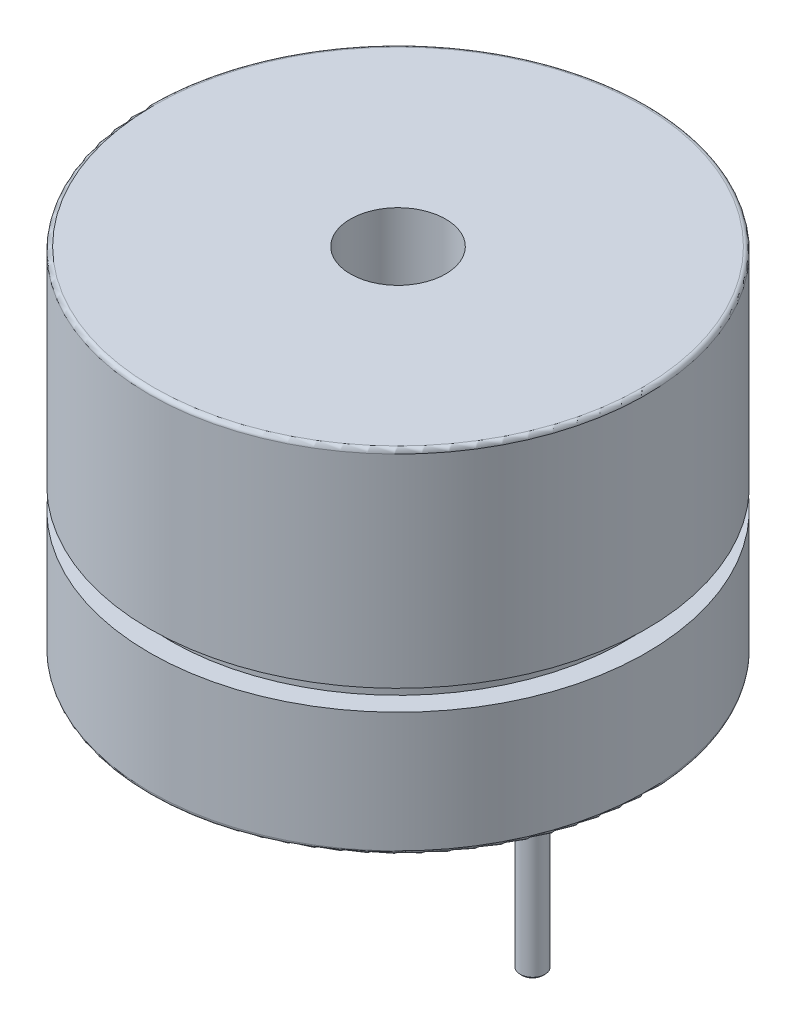
ISO-10303-21;
HEADER;
FILE_DESCRIPTION(('STEP AP214'),'2;1');
FILE_NAME('part.step','',(''),(''),'','','');
FILE_SCHEMA(('AUTOMOTIVE_DESIGN { 1 0 10303 214 1 1 1 1 }'));
ENDSEC;
DATA;
#1=APPLICATION_CONTEXT('core data for automotive mechanical design processes');
#2=APPLICATION_PROTOCOL_DEFINITION('international standard','automotive_design',2000,#1);
#3=PRODUCT_CONTEXT('',#1,'mechanical');
#4=PRODUCT('Part','Part','',(#3));
#5=PRODUCT_RELATED_PRODUCT_CATEGORY('part','',(#4));
#6=PRODUCT_DEFINITION_FORMATION('','',#4);
#7=PRODUCT_DEFINITION_CONTEXT('part definition',#1,'design');
#8=PRODUCT_DEFINITION('design','',#6,#7);
#9=PRODUCT_DEFINITION_SHAPE('','',#8);
#10=(LENGTH_UNIT() NAMED_UNIT(*) SI_UNIT(.MILLI.,.METRE.));
#11=(NAMED_UNIT(*) PLANE_ANGLE_UNIT() SI_UNIT($,.RADIAN.));
#12=(NAMED_UNIT(*) SI_UNIT($,.STERADIAN.) SOLID_ANGLE_UNIT());
#13=UNCERTAINTY_MEASURE_WITH_UNIT(LENGTH_MEASURE(1.E-05),#10,'distance_accuracy_value','');
#14=(GEOMETRIC_REPRESENTATION_CONTEXT(3) GLOBAL_UNCERTAINTY_ASSIGNED_CONTEXT((#13)) GLOBAL_UNIT_ASSIGNED_CONTEXT((#10,
#11,#12)) REPRESENTATION_CONTEXT('',''));
#15=CARTESIAN_POINT('',(0.,0.,0.));
#16=DIRECTION('',(0.,0.,1.));
#17=DIRECTION('',(1.,0.,0.));
#18=AXIS2_PLACEMENT_3D('',#15,#16,#17);
#19=CARTESIAN_POINT('',(0.,0.,0.));
#20=DIRECTION('',(0.,1.,0.));
#21=DIRECTION('',(0.,0.,1.));
#22=AXIS2_PLACEMENT_3D('',#19,#20,#21);
#23=PLANE('',#22);
#24=CARTESIAN_POINT('',(0.,0.,0.));
#25=DIRECTION('',(0.,1.,0.));
#26=DIRECTION('',(0.,0.,1.));
#27=AXIS2_PLACEMENT_3D('',#24,#25,#26);
#28=CIRCLE('',#27,5.9);
#29=CARTESIAN_POINT('',(0.,0.,5.9));
#30=VERTEX_POINT('',#29);
#31=EDGE_CURVE('E59',#30,#30,#28,.F.);
#32=ORIENTED_EDGE('',*,*,#31,.T.);
#33=EDGE_LOOP('',(#32));
#34=FACE_BOUND('',#33,.T.);
#35=CARTESIAN_POINT('',(-3.25,0.,0.));
#36=DIRECTION('',(0.,1.,0.));
#37=DIRECTION('',(0.,0.,1.));
#38=AXIS2_PLACEMENT_3D('',#35,#36,#37);
#39=CIRCLE('',#38,0.3);
#40=CARTESIAN_POINT('',(-3.25,0.,0.3));
#41=VERTEX_POINT('',#40);
#42=EDGE_CURVE('E68',#41,#41,#39,.F.);
#43=ORIENTED_EDGE('',*,*,#42,.F.);
#44=EDGE_LOOP('',(#43));
#45=FACE_BOUND('',#44,.T.);
#46=CARTESIAN_POINT('',(3.25,0.,0.));
#47=DIRECTION('',(0.,1.,0.));
#48=DIRECTION('',(0.,0.,1.));
#49=AXIS2_PLACEMENT_3D('',#46,#47,#48);
#50=CIRCLE('',#49,0.3);
#51=CARTESIAN_POINT('',(3.25,0.,0.300000000000004));
#52=VERTEX_POINT('',#51);
#53=EDGE_CURVE('E65',#52,#52,#50,.F.);
#54=ORIENTED_EDGE('',*,*,#53,.F.);
#55=EDGE_LOOP('',(#54));
#56=FACE_BOUND('',#55,.T.);
#57=ADVANCED_FACE('F33',(#34,#45,#56),#23,.F.);
#58=CARTESIAN_POINT('',(0.,3.,0.));
#59=DIRECTION('',(0.,1.,0.));
#60=DIRECTION('',(0.,0.,1.));
#61=AXIS2_PLACEMENT_3D('',#58,#59,#60);
#62=PLANE('',#61);
#63=CARTESIAN_POINT('',(0.,3.,0.));
#64=DIRECTION('',(0.,1.,0.));
#65=DIRECTION('',(0.,0.,1.));
#66=AXIS2_PLACEMENT_3D('',#63,#64,#65);
#67=CIRCLE('',#66,6.);
#68=CARTESIAN_POINT('',(0.,3.,6.));
#69=VERTEX_POINT('',#68);
#70=EDGE_CURVE('E71',#69,#69,#67,.T.);
#71=ORIENTED_EDGE('',*,*,#70,.T.);
#72=EDGE_LOOP('',(#71));
#73=FACE_BOUND('',#72,.T.);
#74=CARTESIAN_POINT('',(0.,3.,0.));
#75=DIRECTION('',(0.,1.,0.));
#76=DIRECTION('',(0.,0.,1.));
#77=AXIS2_PLACEMENT_3D('',#74,#75,#76);
#78=CIRCLE('',#77,5.5);
#79=CARTESIAN_POINT('',(0.,3.,5.5));
#80=VERTEX_POINT('',#79);
#81=EDGE_CURVE('E75',#80,#80,#78,.T.);
#82=ORIENTED_EDGE('',*,*,#81,.F.);
#83=EDGE_LOOP('',(#82));
#84=FACE_BOUND('',#83,.T.);
#85=ADVANCED_FACE('F112',(#73,#84),#62,.T.);
#86=CARTESIAN_POINT('',(0.,3.,0.));
#87=DIRECTION('',(0.,-1.,0.));
#88=DIRECTION('',(0.,0.,-1.));
#89=AXIS2_PLACEMENT_3D('',#86,#87,#88);
#90=CYLINDRICAL_SURFACE('',#89,6.);
#91=CARTESIAN_POINT('',(0.,0.0999999999999998,0.));
#92=DIRECTION('',(0.,1.,0.));
#93=DIRECTION('',(0.,0.,1.));
#94=AXIS2_PLACEMENT_3D('',#91,#92,#93);
#95=CIRCLE('',#94,6.);
#96=CARTESIAN_POINT('',(0.,0.0999999999999998,6.));
#97=VERTEX_POINT('',#96);
#98=EDGE_CURVE('E62',#97,#97,#95,.T.);
#99=ORIENTED_EDGE('',*,*,#98,.T.);
#100=EDGE_LOOP('',(#99));
#101=FACE_BOUND('',#100,.T.);
#102=ORIENTED_EDGE('',*,*,#70,.F.);
#103=EDGE_LOOP('',(#102));
#104=FACE_BOUND('',#103,.T.);
#105=ADVANCED_FACE('F120',(#101,#104),#90,.T.);
#106=CARTESIAN_POINT('',(0.,3.5,0.));
#107=DIRECTION('',(0.,-1.,0.));
#108=DIRECTION('',(0.,0.,-1.));
#109=AXIS2_PLACEMENT_3D('',#106,#107,#108);
#110=CYLINDRICAL_SURFACE('',#109,5.5);
#111=CARTESIAN_POINT('',(0.,3.5,0.));
#112=DIRECTION('',(0.,1.,0.));
#113=DIRECTION('',(0.,0.,1.));
#114=AXIS2_PLACEMENT_3D('',#111,#112,#113);
#115=CIRCLE('',#114,5.5);
#116=CARTESIAN_POINT('',(0.,3.5,5.5));
#117=VERTEX_POINT('',#116);
#118=EDGE_CURVE('E74',#117,#117,#115,.T.);
#119=ORIENTED_EDGE('',*,*,#118,.F.);
#120=EDGE_LOOP('',(#119));
#121=FACE_BOUND('',#120,.T.);
#122=ORIENTED_EDGE('',*,*,#81,.T.);
#123=EDGE_LOOP('',(#122));
#124=FACE_BOUND('',#123,.T.);
#125=ADVANCED_FACE('F127',(#121,#124),#110,.T.);
#126=CARTESIAN_POINT('',(0.,3.5,0.));
#127=DIRECTION('',(0.,1.,0.));
#128=DIRECTION('',(0.,0.,1.));
#129=AXIS2_PLACEMENT_3D('',#126,#127,#128);
#130=PLANE('',#129);
#131=CARTESIAN_POINT('',(0.,3.5,0.));
#132=DIRECTION('',(0.,1.,0.));
#133=DIRECTION('',(0.,0.,1.));
#134=AXIS2_PLACEMENT_3D('',#131,#132,#133);
#135=CIRCLE('',#134,6.);
#136=CARTESIAN_POINT('',(0.,3.5,6.));
#137=VERTEX_POINT('',#136);
#138=EDGE_CURVE('E78',#137,#137,#135,.T.);
#139=ORIENTED_EDGE('',*,*,#138,.F.);
#140=EDGE_LOOP('',(#139));
#141=FACE_BOUND('',#140,.T.);
#142=ORIENTED_EDGE('',*,*,#118,.T.);
#143=EDGE_LOOP('',(#142));
#144=FACE_BOUND('',#143,.T.);
#145=ADVANCED_FACE('F107',(#141,#144),#130,.F.);
#146=CARTESIAN_POINT('',(0.,8.5,0.));
#147=DIRECTION('',(0.,-1.,0.));
#148=DIRECTION('',(0.,0.,-1.));
#149=AXIS2_PLACEMENT_3D('',#146,#147,#148);
#150=CYLINDRICAL_SURFACE('',#149,6.);
#151=CARTESIAN_POINT('',(0.,8.4,0.));
#152=DIRECTION('',(0.,1.,0.));
#153=DIRECTION('',(0.,0.,1.));
#154=AXIS2_PLACEMENT_3D('',#151,#152,#153);
#155=CIRCLE('',#154,6.);
#156=CARTESIAN_POINT('',(0.,8.4,6.));
#157=VERTEX_POINT('',#156);
#158=EDGE_CURVE('E53',#157,#157,#155,.F.);
#159=ORIENTED_EDGE('',*,*,#158,.T.);
#160=EDGE_LOOP('',(#159));
#161=FACE_BOUND('',#160,.T.);
#162=ORIENTED_EDGE('',*,*,#138,.T.);
#163=EDGE_LOOP('',(#162));
#164=FACE_BOUND('',#163,.T.);
#165=ADVANCED_FACE('F100',(#161,#164),#150,.T.);
#166=CARTESIAN_POINT('',(0.,8.5,0.));
#167=DIRECTION('',(0.,1.,0.));
#168=DIRECTION('',(0.,0.,1.));
#169=AXIS2_PLACEMENT_3D('',#166,#167,#168);
#170=PLANE('',#169);
#171=CARTESIAN_POINT('',(0.,8.5,0.));
#172=DIRECTION('',(0.,1.,0.));
#173=DIRECTION('',(0.,0.,1.));
#174=AXIS2_PLACEMENT_3D('',#171,#172,#173);
#175=CIRCLE('',#174,5.9);
#176=CARTESIAN_POINT('',(0.,8.5,5.9));
#177=VERTEX_POINT('',#176);
#178=EDGE_CURVE('E56',#177,#177,#175,.T.);
#179=ORIENTED_EDGE('',*,*,#178,.T.);
#180=EDGE_LOOP('',(#179));
#181=FACE_BOUND('',#180,.T.);
#182=CARTESIAN_POINT('',(0.,8.5,0.));
#183=DIRECTION('',(0.,1.,0.));
#184=DIRECTION('',(0.,0.,1.));
#185=AXIS2_PLACEMENT_3D('',#182,#183,#184);
#186=CIRCLE('',#185,1.15);
#187=CARTESIAN_POINT('',(0.,8.5,1.15));
#188=VERTEX_POINT('',#187);
#189=EDGE_CURVE('E84',#188,#188,#186,.T.);
#190=ORIENTED_EDGE('',*,*,#189,.F.);
#191=EDGE_LOOP('',(#190));
#192=FACE_BOUND('',#191,.T.);
#193=ADVANCED_FACE('F95',(#181,#192),#170,.T.);
#194=CARTESIAN_POINT('',(0.,3.5,0.));
#195=DIRECTION('',(0.,1.,0.));
#196=DIRECTION('',(0.,0.,1.));
#197=AXIS2_PLACEMENT_3D('',#194,#195,#196);
#198=CYLINDRICAL_SURFACE('',#197,1.15);
#199=CARTESIAN_POINT('',(0.,3.5,0.));
#200=DIRECTION('',(0.,1.,0.));
#201=DIRECTION('',(0.,0.,1.));
#202=AXIS2_PLACEMENT_3D('',#199,#200,#201);
#203=CIRCLE('',#202,1.15);
#204=CARTESIAN_POINT('',(0.,3.5,1.15));
#205=VERTEX_POINT('',#204);
#206=EDGE_CURVE('E83',#205,#205,#203,.T.);
#207=ORIENTED_EDGE('',*,*,#206,.F.);
#208=EDGE_LOOP('',(#207));
#209=FACE_BOUND('',#208,.T.);
#210=ORIENTED_EDGE('',*,*,#189,.T.);
#211=EDGE_LOOP('',(#210));
#212=FACE_BOUND('',#211,.T.);
#213=ADVANCED_FACE('F92',(#209,#212),#198,.F.);
#214=CARTESIAN_POINT('',(0.,3.5,0.));
#215=DIRECTION('',(0.,1.,0.));
#216=DIRECTION('',(0.,0.,1.));
#217=AXIS2_PLACEMENT_3D('',#214,#215,#216);
#218=PLANE('',#217);
#219=ORIENTED_EDGE('',*,*,#206,.T.);
#220=EDGE_LOOP('',(#219));
#221=FACE_BOUND('',#220,.T.);
#222=ADVANCED_FACE('F90',(#221),#218,.T.);
#223=CARTESIAN_POINT('',(-3.25,-5.,0.));
#224=DIRECTION('',(0.,1.,0.));
#225=DIRECTION('',(0.,0.,1.));
#226=AXIS2_PLACEMENT_3D('',#223,#224,#225);
#227=CYLINDRICAL_SURFACE('',#226,0.3);
#228=CARTESIAN_POINT('',(-3.25,-4.95,0.));
#229=DIRECTION('',(0.,-1.,0.));
#230=DIRECTION('',(0.,0.,-1.));
#231=AXIS2_PLACEMENT_3D('',#228,#229,#230);
#232=CIRCLE('',#231,0.3);
#233=CARTESIAN_POINT('',(-3.25,-4.95,-0.3));
#234=VERTEX_POINT('',#233);
#235=EDGE_CURVE('E10',#234,#234,#232,.F.);
#236=ORIENTED_EDGE('',*,*,#235,.T.);
#237=EDGE_LOOP('',(#236));
#238=FACE_BOUND('',#237,.T.);
#239=ORIENTED_EDGE('',*,*,#42,.T.);
#240=EDGE_LOOP('',(#239));
#241=FACE_BOUND('',#240,.T.);
#242=ADVANCED_FACE('F160',(#238,#241),#227,.T.);
#243=CARTESIAN_POINT('',(-3.25,-5.,0.));
#244=DIRECTION('',(0.,-1.,0.));
#245=DIRECTION('',(0.,0.,-1.));
#246=AXIS2_PLACEMENT_3D('',#243,#244,#245);
#247=PLANE('',#246);
#248=CARTESIAN_POINT('',(-3.25,-5.,0.));
#249=DIRECTION('',(0.,-1.,0.));
#250=DIRECTION('',(0.,0.,-1.));
#251=AXIS2_PLACEMENT_3D('',#248,#249,#250);
#252=CIRCLE('',#251,0.25);
#253=CARTESIAN_POINT('',(-3.25,-5.,-0.25));
#254=VERTEX_POINT('',#253);
#255=EDGE_CURVE('E40',#254,#254,#252,.T.);
#256=ORIENTED_EDGE('',*,*,#255,.T.);
#257=EDGE_LOOP('',(#256));
#258=FACE_BOUND('',#257,.T.);
#259=ADVANCED_FACE('F154',(#258),#247,.T.);
#260=CARTESIAN_POINT('',(3.25,-5.,0.));
#261=DIRECTION('',(0.,1.,0.));
#262=DIRECTION('',(0.,0.,1.));
#263=AXIS2_PLACEMENT_3D('',#260,#261,#262);
#264=CYLINDRICAL_SURFACE('',#263,0.3);
#265=CARTESIAN_POINT('',(3.25,-4.95,0.));
#266=DIRECTION('',(0.,1.,0.));
#267=DIRECTION('',(0.,0.,1.));
#268=AXIS2_PLACEMENT_3D('',#265,#266,#267);
#269=CIRCLE('',#268,0.3);
#270=CARTESIAN_POINT('',(3.25,-4.95,0.300000000000004));
#271=VERTEX_POINT('',#270);
#272=EDGE_CURVE('E44',#271,#271,#269,.T.);
#273=ORIENTED_EDGE('',*,*,#272,.T.);
#274=EDGE_LOOP('',(#273));
#275=FACE_BOUND('',#274,.T.);
#276=ORIENTED_EDGE('',*,*,#53,.T.);
#277=EDGE_LOOP('',(#276));
#278=FACE_BOUND('',#277,.T.);
#279=ADVANCED_FACE('F149',(#275,#278),#264,.T.);
#280=CARTESIAN_POINT('',(3.25,-5.,0.));
#281=DIRECTION('',(0.,1.,0.));
#282=DIRECTION('',(0.,0.,1.));
#283=AXIS2_PLACEMENT_3D('',#280,#281,#282);
#284=PLANE('',#283);
#285=CARTESIAN_POINT('',(3.25,-5.,0.));
#286=DIRECTION('',(0.,1.,0.));
#287=DIRECTION('',(0.,0.,1.));
#288=AXIS2_PLACEMENT_3D('',#285,#286,#287);
#289=CIRCLE('',#288,0.249999999999997);
#290=CARTESIAN_POINT('',(3.25,-5.,0.25));
#291=VERTEX_POINT('',#290);
#292=EDGE_CURVE('E48',#291,#291,#289,.F.);
#293=ORIENTED_EDGE('',*,*,#292,.T.);
#294=EDGE_LOOP('',(#293));
#295=FACE_BOUND('',#294,.T.);
#296=ADVANCED_FACE('F133',(#295),#284,.F.);
#297=CARTESIAN_POINT('',(0.,0.0999999999999998,0.));
#298=DIRECTION('',(0.,1.,0.));
#299=DIRECTION('',(0.,0.,1.));
#300=AXIS2_PLACEMENT_3D('',#297,#298,#299);
#301=TOROIDAL_SURFACE('',#300,5.9,0.1);
#302=ORIENTED_EDGE('',*,*,#31,.F.);
#303=EDGE_LOOP('',(#302));
#304=FACE_BOUND('',#303,.T.);
#305=ORIENTED_EDGE('',*,*,#98,.F.);
#306=EDGE_LOOP('',(#305));
#307=FACE_BOUND('',#306,.T.);
#308=ADVANCED_FACE('F129',(#304,#307),#301,.T.);
#309=CARTESIAN_POINT('',(0.,8.4,0.));
#310=DIRECTION('',(0.,1.,0.));
#311=DIRECTION('',(0.,0.,1.));
#312=AXIS2_PLACEMENT_3D('',#309,#310,#311);
#313=TOROIDAL_SURFACE('',#312,5.9,0.1);
#314=ORIENTED_EDGE('',*,*,#158,.F.);
#315=EDGE_LOOP('',(#314));
#316=FACE_BOUND('',#315,.T.);
#317=ORIENTED_EDGE('',*,*,#178,.F.);
#318=EDGE_LOOP('',(#317));
#319=FACE_BOUND('',#318,.T.);
#320=ADVANCED_FACE('F132',(#316,#319),#313,.T.);
#321=CARTESIAN_POINT('',(3.25,-5.,0.));
#322=DIRECTION('',(0.,1.,0.));
#323=DIRECTION('',(0.,0.,1.));
#324=AXIS2_PLACEMENT_3D('',#321,#322,#323);
#325=CONICAL_SURFACE('',#324,0.249999999999997,0.785398163397441);
#326=ORIENTED_EDGE('',*,*,#272,.F.);
#327=EDGE_LOOP('',(#326));
#328=FACE_BOUND('',#327,.T.);
#329=ORIENTED_EDGE('',*,*,#292,.F.);
#330=EDGE_LOOP('',(#329));
#331=FACE_BOUND('',#330,.T.);
#332=ADVANCED_FACE('F136',(#328,#331),#325,.T.);
#333=CARTESIAN_POINT('',(-3.25,-5.,0.));
#334=DIRECTION('',(0.,1.,0.));
#335=DIRECTION('',(0.,0.,1.));
#336=AXIS2_PLACEMENT_3D('',#333,#334,#335);
#337=CONICAL_SURFACE('',#336,0.25,0.785398163397476);
#338=ORIENTED_EDGE('',*,*,#235,.F.);
#339=EDGE_LOOP('',(#338));
#340=FACE_BOUND('',#339,.T.);
#341=ORIENTED_EDGE('',*,*,#255,.F.);
#342=EDGE_LOOP('',(#341));
#343=FACE_BOUND('',#342,.T.);
#344=ADVANCED_FACE('F35',(#340,#343),#337,.T.);
#345=CLOSED_SHELL('',(#57,#85,#105,#125,#145,#165,#193,#213,#222,#242,#259,#279,#296,#308,#320,
#332,#344));
#346=MANIFOLD_SOLID_BREP('B2',#345);
#347=ADVANCED_BREP_SHAPE_REPRESENTATION('',(#18,#346),#14);
#348=SHAPE_DEFINITION_REPRESENTATION(#9,#347);
ENDSEC;
END-ISO-10303-21;
